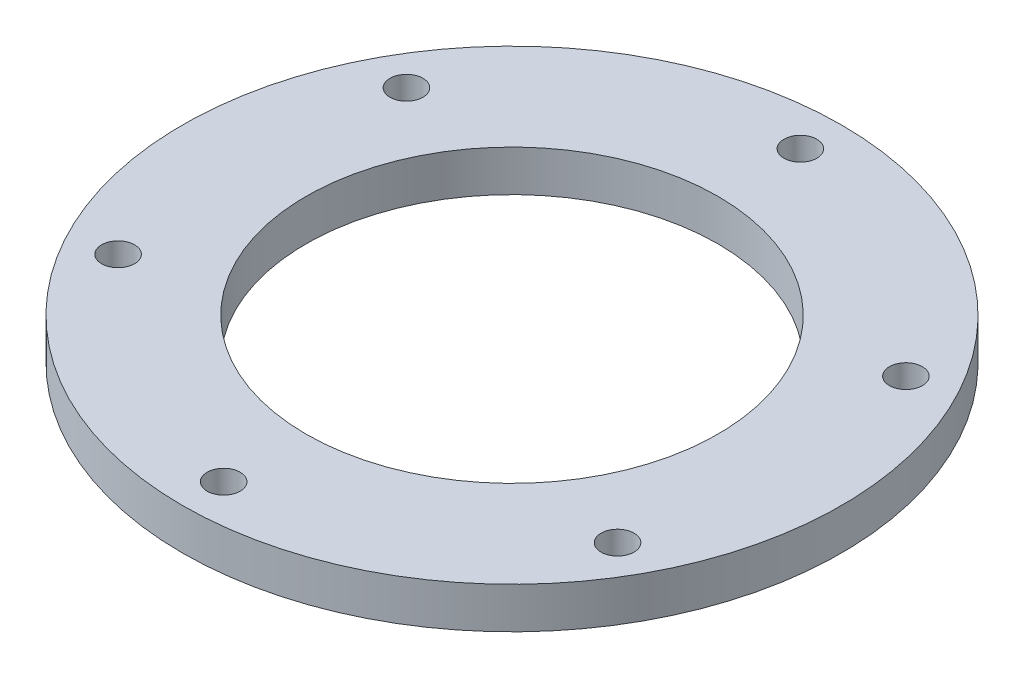
ISO-10303-21;
HEADER;
FILE_DESCRIPTION(('STEP AP214'),'2;1');
FILE_NAME('part.step','',(''),(''),'','','');
FILE_SCHEMA(('AUTOMOTIVE_DESIGN { 1 0 10303 214 1 1 1 1 }'));
ENDSEC;
DATA;
#1=APPLICATION_CONTEXT('core data for automotive mechanical design processes');
#2=APPLICATION_PROTOCOL_DEFINITION('international standard','automotive_design',2000,#1);
#3=PRODUCT_CONTEXT('',#1,'mechanical');
#4=PRODUCT('Part','Part','',(#3));
#5=PRODUCT_RELATED_PRODUCT_CATEGORY('part','',(#4));
#6=PRODUCT_DEFINITION_FORMATION('','',#4);
#7=PRODUCT_DEFINITION_CONTEXT('part definition',#1,'design');
#8=PRODUCT_DEFINITION('design','',#6,#7);
#9=PRODUCT_DEFINITION_SHAPE('','',#8);
#10=(LENGTH_UNIT() NAMED_UNIT(*) SI_UNIT(.MILLI.,.METRE.));
#11=(NAMED_UNIT(*) PLANE_ANGLE_UNIT() SI_UNIT($,.RADIAN.));
#12=(NAMED_UNIT(*) SI_UNIT($,.STERADIAN.) SOLID_ANGLE_UNIT());
#13=UNCERTAINTY_MEASURE_WITH_UNIT(LENGTH_MEASURE(1.E-05),#10,'distance_accuracy_value','');
#14=(GEOMETRIC_REPRESENTATION_CONTEXT(3) GLOBAL_UNCERTAINTY_ASSIGNED_CONTEXT((#13)) GLOBAL_UNIT_ASSIGNED_CONTEXT((#10,
#11,#12)) REPRESENTATION_CONTEXT('',''));
#15=CARTESIAN_POINT('',(0.,0.,0.));
#16=DIRECTION('',(0.,0.,1.));
#17=DIRECTION('',(1.,0.,0.));
#18=AXIS2_PLACEMENT_3D('',#15,#16,#17);
#19=CARTESIAN_POINT('',(0.,5.,0.));
#20=DIRECTION('',(0.,-1.,0.));
#21=DIRECTION('',(0.,0.,-1.));
#22=AXIS2_PLACEMENT_3D('',#19,#20,#21);
#23=CYLINDRICAL_SURFACE('',#22,25.);
#24=CARTESIAN_POINT('',(0.,5.,0.));
#25=DIRECTION('',(0.,1.,0.));
#26=DIRECTION('',(0.,0.,1.));
#27=AXIS2_PLACEMENT_3D('',#24,#25,#26);
#28=CIRCLE('',#27,25.);
#29=CARTESIAN_POINT('',(0.,5.,25.));
#30=VERTEX_POINT('',#29);
#31=EDGE_CURVE('E40',#30,#30,#28,.T.);
#32=ORIENTED_EDGE('',*,*,#31,.T.);
#33=EDGE_LOOP('',(#32));
#34=FACE_BOUND('',#33,.T.);
#35=CARTESIAN_POINT('',(0.,0.,0.));
#36=DIRECTION('',(0.,1.,0.));
#37=DIRECTION('',(0.,0.,1.));
#38=AXIS2_PLACEMENT_3D('',#35,#36,#37);
#39=CIRCLE('',#38,25.);
#40=CARTESIAN_POINT('',(0.,0.,25.));
#41=VERTEX_POINT('',#40);
#42=EDGE_CURVE('E66',#41,#41,#39,.T.);
#43=ORIENTED_EDGE('',*,*,#42,.F.);
#44=EDGE_LOOP('',(#43));
#45=FACE_BOUND('',#44,.T.);
#46=ADVANCED_FACE('F32',(#34,#45),#23,.F.);
#47=CARTESIAN_POINT('',(-30.3108891324546,5.,-17.4999999999987));
#48=DIRECTION('',(0.,-1.,0.));
#49=DIRECTION('',(0.,0.,-1.));
#50=AXIS2_PLACEMENT_3D('',#47,#48,#49);
#51=CYLINDRICAL_SURFACE('',#50,2.00000000000151);
#52=CARTESIAN_POINT('',(-30.3108891324546,5.,-17.4999999999987));
#53=DIRECTION('',(0.,1.,0.));
#54=DIRECTION('',(0.,0.,1.));
#55=AXIS2_PLACEMENT_3D('',#52,#53,#54);
#56=CIRCLE('',#55,2.00000000000151);
#57=CARTESIAN_POINT('',(-30.3108891324546,5.,-15.4999999999972));
#58=VERTEX_POINT('',#57);
#59=EDGE_CURVE('E45',#58,#58,#56,.T.);
#60=ORIENTED_EDGE('',*,*,#59,.T.);
#61=EDGE_LOOP('',(#60));
#62=FACE_BOUND('',#61,.T.);
#63=CARTESIAN_POINT('',(-30.3108891324546,0.,-17.4999999999987));
#64=DIRECTION('',(0.,1.,0.));
#65=DIRECTION('',(0.,0.,1.));
#66=AXIS2_PLACEMENT_3D('',#63,#64,#65);
#67=CIRCLE('',#66,2.00000000000151);
#68=CARTESIAN_POINT('',(-30.3108891324546,0.,-15.4999999999972));
#69=VERTEX_POINT('',#68);
#70=EDGE_CURVE('E64',#69,#69,#67,.T.);
#71=ORIENTED_EDGE('',*,*,#70,.F.);
#72=EDGE_LOOP('',(#71));
#73=FACE_BOUND('',#72,.T.);
#74=ADVANCED_FACE('F93',(#62,#73),#51,.F.);
#75=CARTESIAN_POINT('',(0.,5.,-35.));
#76=DIRECTION('',(0.,-1.,0.));
#77=DIRECTION('',(0.,0.,-1.));
#78=AXIS2_PLACEMENT_3D('',#75,#76,#77);
#79=CYLINDRICAL_SURFACE('',#78,2.);
#80=CARTESIAN_POINT('',(0.,5.,-35.));
#81=DIRECTION('',(0.,1.,0.));
#82=DIRECTION('',(0.,0.,1.));
#83=AXIS2_PLACEMENT_3D('',#80,#81,#82);
#84=CIRCLE('',#83,2.);
#85=CARTESIAN_POINT('',(0.,5.,-33.));
#86=VERTEX_POINT('',#85);
#87=EDGE_CURVE('E88',#86,#86,#84,.T.);
#88=ORIENTED_EDGE('',*,*,#87,.T.);
#89=EDGE_LOOP('',(#88));
#90=FACE_BOUND('',#89,.T.);
#91=CARTESIAN_POINT('',(0.,0.,-35.));
#92=DIRECTION('',(0.,1.,0.));
#93=DIRECTION('',(0.,0.,1.));
#94=AXIS2_PLACEMENT_3D('',#91,#92,#93);
#95=CIRCLE('',#94,2.);
#96=CARTESIAN_POINT('',(0.,0.,-33.));
#97=VERTEX_POINT('',#96);
#98=EDGE_CURVE('E61',#97,#97,#95,.T.);
#99=ORIENTED_EDGE('',*,*,#98,.F.);
#100=EDGE_LOOP('',(#99));
#101=FACE_BOUND('',#100,.T.);
#102=ADVANCED_FACE('F111',(#90,#101),#79,.F.);
#103=CARTESIAN_POINT('',(30.3108891324561,5.,-17.5000000000013));
#104=DIRECTION('',(0.,-1.,0.));
#105=DIRECTION('',(0.,0.,-1.));
#106=AXIS2_PLACEMENT_3D('',#103,#104,#105);
#107=CYLINDRICAL_SURFACE('',#106,2.00000000000041);
#108=CARTESIAN_POINT('',(30.3108891324561,5.,-17.5000000000013));
#109=DIRECTION('',(0.,1.,0.));
#110=DIRECTION('',(0.,0.,1.));
#111=AXIS2_PLACEMENT_3D('',#108,#109,#110);
#112=CIRCLE('',#111,2.00000000000041);
#113=CARTESIAN_POINT('',(30.3108891324561,5.,-15.5000000000009));
#114=VERTEX_POINT('',#113);
#115=EDGE_CURVE('E85',#114,#114,#112,.T.);
#116=ORIENTED_EDGE('',*,*,#115,.T.);
#117=EDGE_LOOP('',(#116));
#118=FACE_BOUND('',#117,.T.);
#119=CARTESIAN_POINT('',(30.3108891324561,0.,-17.5000000000013));
#120=DIRECTION('',(0.,1.,0.));
#121=DIRECTION('',(0.,0.,1.));
#122=AXIS2_PLACEMENT_3D('',#119,#120,#121);
#123=CIRCLE('',#122,2.00000000000041);
#124=CARTESIAN_POINT('',(30.3108891324561,0.,-15.5000000000009));
#125=VERTEX_POINT('',#124);
#126=EDGE_CURVE('E58',#125,#125,#123,.T.);
#127=ORIENTED_EDGE('',*,*,#126,.F.);
#128=EDGE_LOOP('',(#127));
#129=FACE_BOUND('',#128,.T.);
#130=ADVANCED_FACE('F118',(#118,#129),#107,.F.);
#131=CARTESIAN_POINT('',(30.3108891324576,5.,17.4999999999987));
#132=DIRECTION('',(0.,-1.,0.));
#133=DIRECTION('',(0.,0.,-1.));
#134=AXIS2_PLACEMENT_3D('',#131,#132,#133);
#135=CYLINDRICAL_SURFACE('',#134,2.00000000000192);
#136=CARTESIAN_POINT('',(30.3108891324576,5.,17.4999999999987));
#137=DIRECTION('',(0.,1.,0.));
#138=DIRECTION('',(0.,0.,1.));
#139=AXIS2_PLACEMENT_3D('',#136,#137,#138);
#140=CIRCLE('',#139,2.00000000000192);
#141=CARTESIAN_POINT('',(30.3108891324576,5.,19.5000000000006));
#142=VERTEX_POINT('',#141);
#143=EDGE_CURVE('E80',#142,#142,#140,.T.);
#144=ORIENTED_EDGE('',*,*,#143,.T.);
#145=EDGE_LOOP('',(#144));
#146=FACE_BOUND('',#145,.T.);
#147=CARTESIAN_POINT('',(30.3108891324576,0.,17.4999999999987));
#148=DIRECTION('',(0.,1.,0.));
#149=DIRECTION('',(0.,0.,1.));
#150=AXIS2_PLACEMENT_3D('',#147,#148,#149);
#151=CIRCLE('',#150,2.00000000000192);
#152=CARTESIAN_POINT('',(30.3108891324576,0.,19.5000000000006));
#153=VERTEX_POINT('',#152);
#154=EDGE_CURVE('E55',#153,#153,#151,.T.);
#155=ORIENTED_EDGE('',*,*,#154,.F.);
#156=EDGE_LOOP('',(#155));
#157=FACE_BOUND('',#156,.T.);
#158=ADVANCED_FACE('F122',(#146,#157),#135,.F.);
#159=CARTESIAN_POINT('',(2.97570696259839E-12,5.,35.));
#160=DIRECTION('',(0.,-1.,0.));
#161=DIRECTION('',(0.,0.,-1.));
#162=AXIS2_PLACEMENT_3D('',#159,#160,#161);
#163=CYLINDRICAL_SURFACE('',#162,2.00000000000308);
#164=CARTESIAN_POINT('',(2.97570696259839E-12,5.,35.));
#165=DIRECTION('',(0.,1.,0.));
#166=DIRECTION('',(0.,0.,1.));
#167=AXIS2_PLACEMENT_3D('',#164,#165,#166);
#168=CIRCLE('',#167,2.00000000000308);
#169=CARTESIAN_POINT('',(2.97570696259839E-12,5.,37.0000000000031));
#170=VERTEX_POINT('',#169);
#171=EDGE_CURVE('E75',#170,#170,#168,.T.);
#172=ORIENTED_EDGE('',*,*,#171,.T.);
#173=EDGE_LOOP('',(#172));
#174=FACE_BOUND('',#173,.T.);
#175=CARTESIAN_POINT('',(2.97570696259839E-12,0.,35.));
#176=DIRECTION('',(0.,1.,0.));
#177=DIRECTION('',(0.,0.,1.));
#178=AXIS2_PLACEMENT_3D('',#175,#176,#177);
#179=CIRCLE('',#178,2.00000000000308);
#180=CARTESIAN_POINT('',(2.97570696259839E-12,0.,37.0000000000031));
#181=VERTEX_POINT('',#180);
#182=EDGE_CURVE('E52',#181,#181,#179,.T.);
#183=ORIENTED_EDGE('',*,*,#182,.F.);
#184=EDGE_LOOP('',(#183));
#185=FACE_BOUND('',#184,.T.);
#186=ADVANCED_FACE('F125',(#174,#185),#163,.F.);
#187=CARTESIAN_POINT('',(-30.3108891324531,5.,17.5000000000013));
#188=DIRECTION('',(0.,-1.,0.));
#189=DIRECTION('',(0.,0.,-1.));
#190=AXIS2_PLACEMENT_3D('',#187,#188,#189);
#191=CYLINDRICAL_SURFACE('',#190,2.00000000000283);
#192=CARTESIAN_POINT('',(-30.3108891324531,5.,17.5000000000013));
#193=DIRECTION('',(0.,1.,0.));
#194=DIRECTION('',(0.,0.,1.));
#195=AXIS2_PLACEMENT_3D('',#192,#193,#194);
#196=CIRCLE('',#195,2.00000000000283);
#197=CARTESIAN_POINT('',(-30.3108891324531,5.,19.5000000000041));
#198=VERTEX_POINT('',#197);
#199=EDGE_CURVE('E71',#198,#198,#196,.T.);
#200=ORIENTED_EDGE('',*,*,#199,.T.);
#201=EDGE_LOOP('',(#200));
#202=FACE_BOUND('',#201,.T.);
#203=CARTESIAN_POINT('',(-30.3108891324531,0.,17.5000000000013));
#204=DIRECTION('',(0.,1.,0.));
#205=DIRECTION('',(0.,0.,1.));
#206=AXIS2_PLACEMENT_3D('',#203,#204,#205);
#207=CIRCLE('',#206,2.00000000000283);
#208=CARTESIAN_POINT('',(-30.3108891324531,0.,19.5000000000041));
#209=VERTEX_POINT('',#208);
#210=EDGE_CURVE('E49',#209,#209,#207,.T.);
#211=ORIENTED_EDGE('',*,*,#210,.F.);
#212=EDGE_LOOP('',(#211));
#213=FACE_BOUND('',#212,.T.);
#214=ADVANCED_FACE('F34',(#202,#213),#191,.F.);
#215=CARTESIAN_POINT('',(0.,5.,0.));
#216=DIRECTION('',(0.,-1.,0.));
#217=DIRECTION('',(0.,0.,-1.));
#218=AXIS2_PLACEMENT_3D('',#215,#216,#217);
#219=CYLINDRICAL_SURFACE('',#218,40.);
#220=CARTESIAN_POINT('',(0.,5.,0.));
#221=DIRECTION('',(0.,1.,0.));
#222=DIRECTION('',(0.,0.,1.));
#223=AXIS2_PLACEMENT_3D('',#220,#221,#222);
#224=CIRCLE('',#223,40.);
#225=CARTESIAN_POINT('',(0.,5.,40.));
#226=VERTEX_POINT('',#225);
#227=EDGE_CURVE('E10',#226,#226,#224,.T.);
#228=ORIENTED_EDGE('',*,*,#227,.F.);
#229=EDGE_LOOP('',(#228));
#230=FACE_BOUND('',#229,.T.);
#231=CARTESIAN_POINT('',(0.,0.,0.));
#232=DIRECTION('',(0.,1.,0.));
#233=DIRECTION('',(0.,0.,1.));
#234=AXIS2_PLACEMENT_3D('',#231,#232,#233);
#235=CIRCLE('',#234,40.);
#236=CARTESIAN_POINT('',(0.,0.,40.));
#237=VERTEX_POINT('',#236);
#238=EDGE_CURVE('E36',#237,#237,#235,.T.);
#239=ORIENTED_EDGE('',*,*,#238,.T.);
#240=EDGE_LOOP('',(#239));
#241=FACE_BOUND('',#240,.T.);
#242=ADVANCED_FACE('F100',(#230,#241),#219,.T.);
#243=CARTESIAN_POINT('',(0.,5.,0.));
#244=DIRECTION('',(0.,1.,0.));
#245=DIRECTION('',(0.,0.,1.));
#246=AXIS2_PLACEMENT_3D('',#243,#244,#245);
#247=PLANE('',#246);
#248=ORIENTED_EDGE('',*,*,#199,.F.);
#249=EDGE_LOOP('',(#248));
#250=FACE_BOUND('',#249,.T.);
#251=ORIENTED_EDGE('',*,*,#171,.F.);
#252=EDGE_LOOP('',(#251));
#253=FACE_BOUND('',#252,.T.);
#254=ORIENTED_EDGE('',*,*,#143,.F.);
#255=EDGE_LOOP('',(#254));
#256=FACE_BOUND('',#255,.T.);
#257=ORIENTED_EDGE('',*,*,#115,.F.);
#258=EDGE_LOOP('',(#257));
#259=FACE_BOUND('',#258,.T.);
#260=ORIENTED_EDGE('',*,*,#87,.F.);
#261=EDGE_LOOP('',(#260));
#262=FACE_BOUND('',#261,.T.);
#263=ORIENTED_EDGE('',*,*,#59,.F.);
#264=EDGE_LOOP('',(#263));
#265=FACE_BOUND('',#264,.T.);
#266=ORIENTED_EDGE('',*,*,#31,.F.);
#267=EDGE_LOOP('',(#266));
#268=FACE_BOUND('',#267,.T.);
#269=ORIENTED_EDGE('',*,*,#227,.T.);
#270=EDGE_LOOP('',(#269));
#271=FACE_BOUND('',#270,.T.);
#272=ADVANCED_FACE('F96',(#250,#253,#256,#259,#262,#265,#268,#271),#247,.T.);
#273=CARTESIAN_POINT('',(0.,0.,0.));
#274=DIRECTION('',(0.,1.,0.));
#275=DIRECTION('',(0.,0.,1.));
#276=AXIS2_PLACEMENT_3D('',#273,#274,#275);
#277=PLANE('',#276);
#278=ORIENTED_EDGE('',*,*,#210,.T.);
#279=EDGE_LOOP('',(#278));
#280=FACE_BOUND('',#279,.T.);
#281=ORIENTED_EDGE('',*,*,#182,.T.);
#282=EDGE_LOOP('',(#281));
#283=FACE_BOUND('',#282,.T.);
#284=ORIENTED_EDGE('',*,*,#154,.T.);
#285=EDGE_LOOP('',(#284));
#286=FACE_BOUND('',#285,.T.);
#287=ORIENTED_EDGE('',*,*,#126,.T.);
#288=EDGE_LOOP('',(#287));
#289=FACE_BOUND('',#288,.T.);
#290=ORIENTED_EDGE('',*,*,#98,.T.);
#291=EDGE_LOOP('',(#290));
#292=FACE_BOUND('',#291,.T.);
#293=ORIENTED_EDGE('',*,*,#70,.T.);
#294=EDGE_LOOP('',(#293));
#295=FACE_BOUND('',#294,.T.);
#296=ORIENTED_EDGE('',*,*,#42,.T.);
#297=EDGE_LOOP('',(#296));
#298=FACE_BOUND('',#297,.T.);
#299=ORIENTED_EDGE('',*,*,#238,.F.);
#300=EDGE_LOOP('',(#299));
#301=FACE_BOUND('',#300,.T.);
#302=ADVANCED_FACE('F99',(#280,#283,#286,#289,#292,#295,#298,#301),#277,.F.);
#303=CLOSED_SHELL('',(#46,#74,#102,#130,#158,#186,#214,#242,#272,#302));
#304=MANIFOLD_SOLID_BREP('B2',#303);
#305=ADVANCED_BREP_SHAPE_REPRESENTATION('',(#18,#304),#14);
#306=SHAPE_DEFINITION_REPRESENTATION(#9,#305);
ENDSEC;
END-ISO-10303-21;
